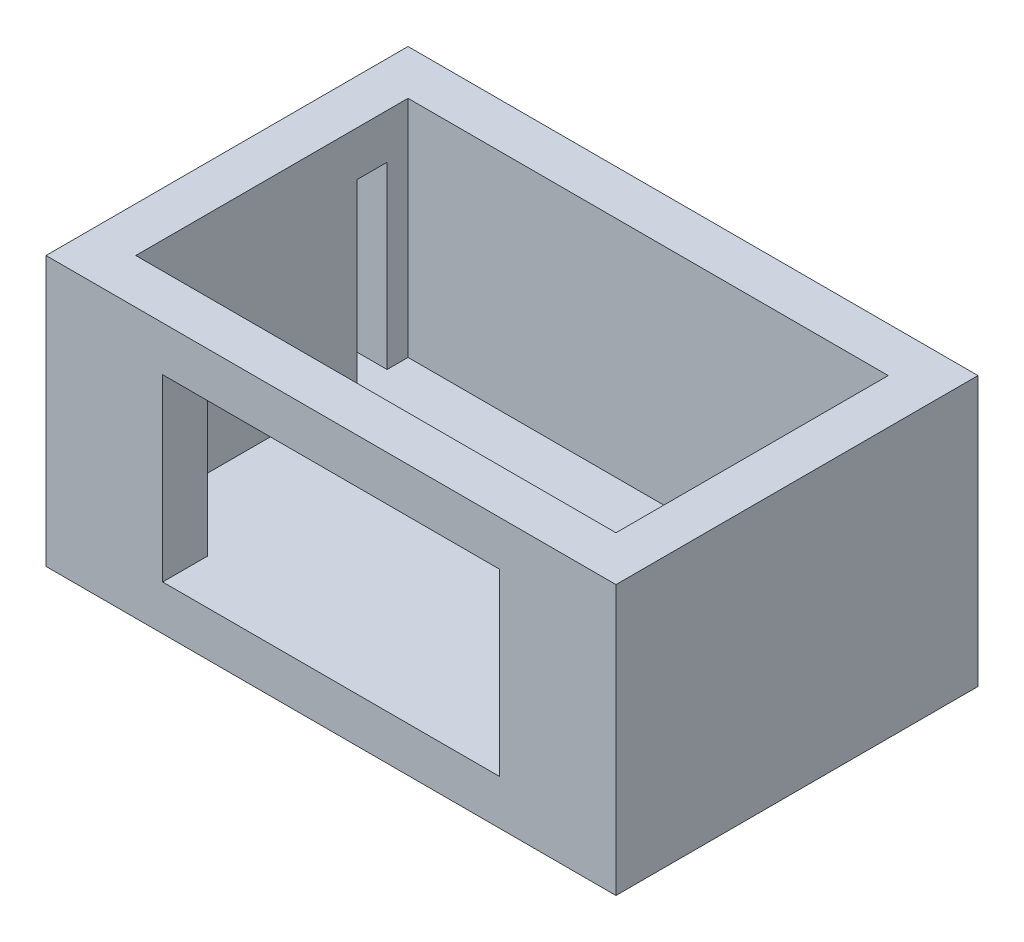
ISO-10303-21;
HEADER;
FILE_DESCRIPTION(('STEP AP214'),'2;1');
FILE_NAME('part.step','',(''),(''),'','','');
FILE_SCHEMA(('AUTOMOTIVE_DESIGN { 1 0 10303 214 1 1 1 1 }'));
ENDSEC;
DATA;
#1=APPLICATION_CONTEXT('core data for automotive mechanical design processes');
#2=APPLICATION_PROTOCOL_DEFINITION('international standard','automotive_design',2000,#1);
#3=PRODUCT_CONTEXT('',#1,'mechanical');
#4=PRODUCT('Part','Part','',(#3));
#5=PRODUCT_RELATED_PRODUCT_CATEGORY('part','',(#4));
#6=PRODUCT_DEFINITION_FORMATION('','',#4);
#7=PRODUCT_DEFINITION_CONTEXT('part definition',#1,'design');
#8=PRODUCT_DEFINITION('design','',#6,#7);
#9=PRODUCT_DEFINITION_SHAPE('','',#8);
#10=(LENGTH_UNIT() NAMED_UNIT(*) SI_UNIT(.MILLI.,.METRE.));
#11=(NAMED_UNIT(*) PLANE_ANGLE_UNIT() SI_UNIT($,.RADIAN.));
#12=(NAMED_UNIT(*) SI_UNIT($,.STERADIAN.) SOLID_ANGLE_UNIT());
#13=UNCERTAINTY_MEASURE_WITH_UNIT(LENGTH_MEASURE(1.E-05),#10,'distance_accuracy_value','');
#14=(GEOMETRIC_REPRESENTATION_CONTEXT(3) GLOBAL_UNCERTAINTY_ASSIGNED_CONTEXT((#13)) GLOBAL_UNIT_ASSIGNED_CONTEXT((#10,
#11,#12)) REPRESENTATION_CONTEXT('',''));
#15=CARTESIAN_POINT('',(0.,0.,0.));
#16=DIRECTION('',(0.,0.,1.));
#17=DIRECTION('',(1.,0.,0.));
#18=AXIS2_PLACEMENT_3D('',#15,#16,#17);
#19=CARTESIAN_POINT('',(-37.6640667415845,18.,-26.7994321045889));
#20=DIRECTION('',(1.,0.,0.));
#21=DIRECTION('',(0.,0.,-1.));
#22=AXIS2_PLACEMENT_3D('',#19,#20,#21);
#23=PLANE('',#22);
#24=DIRECTION('',(0.,-1.,0.));
#25=VECTOR('',#24,1.);
#26=CARTESIAN_POINT('',(-37.6640667415845,15.,-20.3994321045889));
#27=LINE('',#26,#25);
#28=CARTESIAN_POINT('',(-37.6640667415845,15.,-20.3994321045889));
#29=VERTEX_POINT('',#28);
#30=CARTESIAN_POINT('',(-37.6640667415845,3.,-20.3994321045889));
#31=VERTEX_POINT('',#30);
#32=EDGE_CURVE('E159',#29,#31,#27,.T.);
#33=ORIENTED_EDGE('',*,*,#32,.T.);
#34=DIRECTION('',(0.,0.,1.));
#35=VECTOR('',#34,1.);
#36=CARTESIAN_POINT('',(-37.6640667415845,3.,-22.3994321045889));
#37=LINE('',#36,#35);
#38=CARTESIAN_POINT('',(-37.6640667415845,3.,-22.3994321045889));
#39=VERTEX_POINT('',#38);
#40=EDGE_CURVE('E46',#39,#31,#37,.T.);
#41=ORIENTED_EDGE('',*,*,#40,.F.);
#42=DIRECTION('',(0.,-1.,0.));
#43=VECTOR('',#42,1.);
#44=CARTESIAN_POINT('',(-37.6640667415845,15.,-22.3994321045889));
#45=LINE('',#44,#43);
#46=CARTESIAN_POINT('',(-37.6640667415845,15.,-22.3994321045889));
#47=VERTEX_POINT('',#46);
#48=EDGE_CURVE('E165',#47,#39,#45,.T.);
#49=ORIENTED_EDGE('',*,*,#48,.F.);
#50=DIRECTION('',(0.,0.,1.));
#51=VECTOR('',#50,1.);
#52=CARTESIAN_POINT('',(-37.6640667415845,15.,-22.3994321045889));
#53=LINE('',#52,#51);
#54=EDGE_CURVE('E168',#47,#29,#53,.T.);
#55=ORIENTED_EDGE('',*,*,#54,.T.);
#56=EDGE_LOOP('',(#33,#41,#49,#55));
#57=FACE_BOUND('',#56,.T.);
#58=DIRECTION('',(0.,0.,1.));
#59=VECTOR('',#58,1.);
#60=CARTESIAN_POINT('',(-37.6640667415845,0.,-26.7994321045889));
#61=LINE('',#60,#59);
#62=CARTESIAN_POINT('',(-37.6640667415845,0.,-26.7994321045889));
#63=VERTEX_POINT('',#62);
#64=CARTESIAN_POINT('',(-37.6640667415845,0.,-2.59943210458896));
#65=VERTEX_POINT('',#64);
#66=EDGE_CURVE('E213',#63,#65,#61,.T.);
#67=ORIENTED_EDGE('',*,*,#66,.T.);
#68=DIRECTION('',(0.,-1.,0.));
#69=VECTOR('',#68,1.);
#70=CARTESIAN_POINT('',(-37.6640667415845,18.,-2.59943210458896));
#71=LINE('',#70,#69);
#72=CARTESIAN_POINT('',(-37.6640667415845,18.,-2.59943210458896));
#73=VERTEX_POINT('',#72);
#74=EDGE_CURVE('E11',#73,#65,#71,.T.);
#75=ORIENTED_EDGE('',*,*,#74,.F.);
#76=DIRECTION('',(0.,0.,1.));
#77=VECTOR('',#76,1.);
#78=CARTESIAN_POINT('',(-37.6640667415845,18.,-26.7994321045889));
#79=LINE('',#78,#77);
#80=CARTESIAN_POINT('',(-37.6640667415845,18.,-26.7994321045889));
#81=VERTEX_POINT('',#80);
#82=EDGE_CURVE('E239',#81,#73,#79,.T.);
#83=ORIENTED_EDGE('',*,*,#82,.F.);
#84=DIRECTION('',(0.,-1.,0.));
#85=VECTOR('',#84,1.);
#86=CARTESIAN_POINT('',(-37.6640667415845,18.,-26.7994321045889));
#87=LINE('',#86,#85);
#88=EDGE_CURVE('E249',#81,#63,#87,.T.);
#89=ORIENTED_EDGE('',*,*,#88,.T.);
#90=EDGE_LOOP('',(#67,#75,#83,#89));
#91=FACE_BOUND('',#90,.T.);
#92=ADVANCED_FACE('F32',(#57,#91),#23,.F.);
#93=CARTESIAN_POINT('',(-37.6640667415845,18.,-2.59943210458896));
#94=DIRECTION('',(0.,0.,-1.));
#95=DIRECTION('',(-1.,0.,0.));
#96=AXIS2_PLACEMENT_3D('',#93,#94,#95);
#97=PLANE('',#96);
#98=DIRECTION('',(0.,-1.,0.));
#99=VECTOR('',#98,1.);
#100=CARTESIAN_POINT('',(-7.36406674158448,15.,-2.59943210458896));
#101=LINE('',#100,#99);
#102=CARTESIAN_POINT('',(-7.36406674158448,15.,-2.59943210458896));
#103=VERTEX_POINT('',#102);
#104=CARTESIAN_POINT('',(-7.36406674158448,3.,-2.59943210458896));
#105=VERTEX_POINT('',#104);
#106=EDGE_CURVE('E191',#103,#105,#101,.T.);
#107=ORIENTED_EDGE('',*,*,#106,.T.);
#108=DIRECTION('',(1.,0.,0.));
#109=VECTOR('',#108,1.);
#110=CARTESIAN_POINT('',(-29.8640667415845,3.,-2.59943210458896));
#111=LINE('',#110,#109);
#112=CARTESIAN_POINT('',(-29.8640667415845,3.,-2.59943210458896));
#113=VERTEX_POINT('',#112);
#114=EDGE_CURVE('E177',#113,#105,#111,.T.);
#115=ORIENTED_EDGE('',*,*,#114,.F.);
#116=DIRECTION('',(0.,-1.,0.));
#117=VECTOR('',#116,1.);
#118=CARTESIAN_POINT('',(-29.8640667415845,15.,-2.59943210458896));
#119=LINE('',#118,#117);
#120=CARTESIAN_POINT('',(-29.8640667415845,15.,-2.59943210458896));
#121=VERTEX_POINT('',#120);
#122=EDGE_CURVE('E184',#121,#113,#119,.T.);
#123=ORIENTED_EDGE('',*,*,#122,.F.);
#124=DIRECTION('',(1.,0.,0.));
#125=VECTOR('',#124,1.);
#126=CARTESIAN_POINT('',(-29.8640667415845,15.,-2.59943210458896));
#127=LINE('',#126,#125);
#128=EDGE_CURVE('E194',#121,#103,#127,.T.);
#129=ORIENTED_EDGE('',*,*,#128,.T.);
#130=EDGE_LOOP('',(#107,#115,#123,#129));
#131=FACE_BOUND('',#130,.T.);
#132=DIRECTION('',(1.,0.,0.));
#133=VECTOR('',#132,1.);
#134=CARTESIAN_POINT('',(-37.6640667415845,0.,-2.59943210458896));
#135=LINE('',#134,#133);
#136=CARTESIAN_POINT('',(0.435933258415518,0.,-2.59943210458896));
#137=VERTEX_POINT('',#136);
#138=EDGE_CURVE('E252',#65,#137,#135,.T.);
#139=ORIENTED_EDGE('',*,*,#138,.T.);
#140=DIRECTION('',(0.,-1.,0.));
#141=VECTOR('',#140,1.);
#142=CARTESIAN_POINT('',(0.435933258415518,18.,-2.59943210458896));
#143=LINE('',#142,#141);
#144=CARTESIAN_POINT('',(0.435933258415518,18.,-2.59943210458896));
#145=VERTEX_POINT('',#144);
#146=EDGE_CURVE('E39',#145,#137,#143,.T.);
#147=ORIENTED_EDGE('',*,*,#146,.F.);
#148=DIRECTION('',(1.,0.,0.));
#149=VECTOR('',#148,1.);
#150=CARTESIAN_POINT('',(-37.6640667415845,18.,-2.59943210458896));
#151=LINE('',#150,#149);
#152=EDGE_CURVE('E242',#73,#145,#151,.T.);
#153=ORIENTED_EDGE('',*,*,#152,.F.);
#154=ORIENTED_EDGE('',*,*,#74,.T.);
#155=EDGE_LOOP('',(#139,#147,#153,#154));
#156=FACE_BOUND('',#155,.T.);
#157=ADVANCED_FACE('F282',(#131,#156),#97,.F.);
#158=CARTESIAN_POINT('',(0.435933258415518,18.,-26.7994321045889));
#159=DIRECTION('',(-1.,0.,0.));
#160=DIRECTION('',(0.,0.,1.));
#161=AXIS2_PLACEMENT_3D('',#158,#159,#160);
#162=PLANE('',#161);
#163=DIRECTION('',(0.,0.,-1.));
#164=VECTOR('',#163,1.);
#165=CARTESIAN_POINT('',(0.435933258415518,0.,-26.7994321045889));
#166=LINE('',#165,#164);
#167=CARTESIAN_POINT('',(0.435933258415518,0.,-26.7994321045889));
#168=VERTEX_POINT('',#167);
#169=EDGE_CURVE('E254',#137,#168,#166,.T.);
#170=ORIENTED_EDGE('',*,*,#169,.T.);
#171=DIRECTION('',(0.,-1.,0.));
#172=VECTOR('',#171,1.);
#173=CARTESIAN_POINT('',(0.435933258415518,18.,-26.7994321045889));
#174=LINE('',#173,#172);
#175=CARTESIAN_POINT('',(0.435933258415518,18.,-26.7994321045889));
#176=VERTEX_POINT('',#175);
#177=EDGE_CURVE('E259',#176,#168,#174,.T.);
#178=ORIENTED_EDGE('',*,*,#177,.F.);
#179=DIRECTION('',(0.,0.,-1.));
#180=VECTOR('',#179,1.);
#181=CARTESIAN_POINT('',(0.435933258415518,18.,-26.7994321045889));
#182=LINE('',#181,#180);
#183=EDGE_CURVE('E245',#145,#176,#182,.T.);
#184=ORIENTED_EDGE('',*,*,#183,.F.);
#185=ORIENTED_EDGE('',*,*,#146,.T.);
#186=EDGE_LOOP('',(#170,#178,#184,#185));
#187=FACE_BOUND('',#186,.T.);
#188=ADVANCED_FACE('F266',(#187),#162,.F.);
#189=CARTESIAN_POINT('',(-37.6640667415845,18.,-26.7994321045889));
#190=DIRECTION('',(0.,0.,1.));
#191=DIRECTION('',(1.,0.,0.));
#192=AXIS2_PLACEMENT_3D('',#189,#190,#191);
#193=PLANE('',#192);
#194=DIRECTION('',(-1.,0.,0.));
#195=VECTOR('',#194,1.);
#196=CARTESIAN_POINT('',(-37.6640667415845,0.,-26.7994321045889));
#197=LINE('',#196,#195);
#198=EDGE_CURVE('E243',#168,#63,#197,.T.);
#199=ORIENTED_EDGE('',*,*,#198,.T.);
#200=ORIENTED_EDGE('',*,*,#88,.F.);
#201=DIRECTION('',(-1.,0.,0.));
#202=VECTOR('',#201,1.);
#203=CARTESIAN_POINT('',(-37.6640667415845,18.,-26.7994321045889));
#204=LINE('',#203,#202);
#205=EDGE_CURVE('E247',#176,#81,#204,.T.);
#206=ORIENTED_EDGE('',*,*,#205,.F.);
#207=ORIENTED_EDGE('',*,*,#177,.T.);
#208=EDGE_LOOP('',(#199,#200,#206,#207));
#209=FACE_BOUND('',#208,.T.);
#210=ADVANCED_FACE('F275',(#209),#193,.F.);
#211=CARTESIAN_POINT('',(0.,18.,0.));
#212=DIRECTION('',(0.,1.,0.));
#213=DIRECTION('',(0.,0.,1.));
#214=AXIS2_PLACEMENT_3D('',#211,#212,#213);
#215=PLANE('',#214);
#216=DIRECTION('',(0.,0.,1.));
#217=VECTOR('',#216,1.);
#218=CARTESIAN_POINT('',(-34.6640667415845,18.,-26.7994321045889));
#219=LINE('',#218,#217);
#220=CARTESIAN_POINT('',(-34.6640667415845,18.,-23.7994321045889));
#221=VERTEX_POINT('',#220);
#222=CARTESIAN_POINT('',(-34.6640667415845,18.,-5.59943210458896));
#223=VERTEX_POINT('',#222);
#224=EDGE_CURVE('E231',#221,#223,#219,.T.);
#225=ORIENTED_EDGE('',*,*,#224,.F.);
#226=DIRECTION('',(-1.,0.,0.));
#227=VECTOR('',#226,1.);
#228=CARTESIAN_POINT('',(-37.6640667415845,18.,-23.7994321045889));
#229=LINE('',#228,#227);
#230=CARTESIAN_POINT('',(-2.56406674158448,18.,-23.7994321045889));
#231=VERTEX_POINT('',#230);
#232=EDGE_CURVE('E219',#231,#221,#229,.T.);
#233=ORIENTED_EDGE('',*,*,#232,.F.);
#234=DIRECTION('',(0.,0.,-1.));
#235=VECTOR('',#234,1.);
#236=CARTESIAN_POINT('',(-2.56406674158448,18.,-26.7994321045889));
#237=LINE('',#236,#235);
#238=CARTESIAN_POINT('',(-2.56406674158448,18.,-5.59943210458896));
#239=VERTEX_POINT('',#238);
#240=EDGE_CURVE('E235',#239,#231,#237,.T.);
#241=ORIENTED_EDGE('',*,*,#240,.F.);
#242=DIRECTION('',(1.,0.,0.));
#243=VECTOR('',#242,1.);
#244=CARTESIAN_POINT('',(-37.6640667415845,18.,-5.59943210458896));
#245=LINE('',#244,#243);
#246=EDGE_CURVE('E233',#223,#239,#245,.T.);
#247=ORIENTED_EDGE('',*,*,#246,.F.);
#248=EDGE_LOOP('',(#225,#233,#241,#247));
#249=FACE_BOUND('',#248,.T.);
#250=ORIENTED_EDGE('',*,*,#82,.T.);
#251=ORIENTED_EDGE('',*,*,#152,.T.);
#252=ORIENTED_EDGE('',*,*,#183,.T.);
#253=ORIENTED_EDGE('',*,*,#205,.T.);
#254=EDGE_LOOP('',(#250,#251,#252,#253));
#255=FACE_BOUND('',#254,.T.);
#256=ADVANCED_FACE('F281',(#249,#255),#215,.T.);
#257=CARTESIAN_POINT('',(0.,0.,0.));
#258=DIRECTION('',(0.,1.,0.));
#259=DIRECTION('',(0.,0.,1.));
#260=AXIS2_PLACEMENT_3D('',#257,#258,#259);
#261=PLANE('',#260);
#262=ORIENTED_EDGE('',*,*,#66,.F.);
#263=ORIENTED_EDGE('',*,*,#198,.F.);
#264=ORIENTED_EDGE('',*,*,#169,.F.);
#265=ORIENTED_EDGE('',*,*,#138,.F.);
#266=EDGE_LOOP('',(#262,#263,#264,#265));
#267=FACE_BOUND('',#266,.T.);
#268=ADVANCED_FACE('F272',(#267),#261,.F.);
#269=CARTESIAN_POINT('',(-34.6640667415845,18.,-26.7994321045889));
#270=DIRECTION('',(1.,0.,0.));
#271=DIRECTION('',(0.,0.,-1.));
#272=AXIS2_PLACEMENT_3D('',#269,#270,#271);
#273=PLANE('',#272);
#274=DIRECTION('',(0.,-1.,0.));
#275=VECTOR('',#274,1.);
#276=CARTESIAN_POINT('',(-34.6640667415845,15.,-22.3994321045889));
#277=LINE('',#276,#275);
#278=CARTESIAN_POINT('',(-34.6640667415845,15.,-22.3994321045889));
#279=VERTEX_POINT('',#278);
#280=CARTESIAN_POINT('',(-34.6640667415845,3.,-22.3994321045889));
#281=VERTEX_POINT('',#280);
#282=EDGE_CURVE('E152',#279,#281,#277,.T.);
#283=ORIENTED_EDGE('',*,*,#282,.T.);
#284=DIRECTION('',(0.,0.,1.));
#285=VECTOR('',#284,1.);
#286=CARTESIAN_POINT('',(-34.6640667415845,3.,-26.7994321045889));
#287=LINE('',#286,#285);
#288=CARTESIAN_POINT('',(-34.6640667415845,3.,-23.7994321045889));
#289=VERTEX_POINT('',#288);
#290=EDGE_CURVE('E207',#289,#281,#287,.T.);
#291=ORIENTED_EDGE('',*,*,#290,.F.);
#292=DIRECTION('',(0.,-1.,0.));
#293=VECTOR('',#292,1.);
#294=CARTESIAN_POINT('',(-34.6640667415845,18.,-23.7994321045889));
#295=LINE('',#294,#293);
#296=EDGE_CURVE('E215',#221,#289,#295,.T.);
#297=ORIENTED_EDGE('',*,*,#296,.F.);
#298=ORIENTED_EDGE('',*,*,#224,.T.);
#299=DIRECTION('',(0.,-1.,0.));
#300=VECTOR('',#299,1.);
#301=CARTESIAN_POINT('',(-34.6640667415845,18.,-5.59943210458896));
#302=LINE('',#301,#300);
#303=CARTESIAN_POINT('',(-34.6640667415845,3.,-5.59943210458896));
#304=VERTEX_POINT('',#303);
#305=EDGE_CURVE('E211',#223,#304,#302,.T.);
#306=ORIENTED_EDGE('',*,*,#305,.T.);
#307=CARTESIAN_POINT('',(-34.6640667415845,3.,-20.3994321045889));
#308=VERTEX_POINT('',#307);
#309=EDGE_CURVE('E164',#308,#304,#287,.T.);
#310=ORIENTED_EDGE('',*,*,#309,.F.);
#311=DIRECTION('',(0.,-1.,0.));
#312=VECTOR('',#311,1.);
#313=CARTESIAN_POINT('',(-34.6640667415845,15.,-20.3994321045889));
#314=LINE('',#313,#312);
#315=CARTESIAN_POINT('',(-34.6640667415845,15.,-20.3994321045889));
#316=VERTEX_POINT('',#315);
#317=EDGE_CURVE('E153',#316,#308,#314,.T.);
#318=ORIENTED_EDGE('',*,*,#317,.F.);
#319=DIRECTION('',(0.,0.,1.));
#320=VECTOR('',#319,1.);
#321=CARTESIAN_POINT('',(-34.6640667415845,15.,-22.3994321045889));
#322=LINE('',#321,#320);
#323=EDGE_CURVE('E141',#279,#316,#322,.T.);
#324=ORIENTED_EDGE('',*,*,#323,.F.);
#325=EDGE_LOOP('',(#283,#291,#297,#298,#306,#310,#318,#324));
#326=FACE_BOUND('',#325,.T.);
#327=ADVANCED_FACE('F162',(#326),#273,.T.);
#328=CARTESIAN_POINT('',(-37.6640667415845,18.,-5.59943210458896));
#329=DIRECTION('',(0.,0.,-1.));
#330=DIRECTION('',(-1.,0.,0.));
#331=AXIS2_PLACEMENT_3D('',#328,#329,#330);
#332=PLANE('',#331);
#333=DIRECTION('',(0.,-1.,0.));
#334=VECTOR('',#333,1.);
#335=CARTESIAN_POINT('',(-29.8640667415845,15.,-5.59943210458896));
#336=LINE('',#335,#334);
#337=CARTESIAN_POINT('',(-29.8640667415845,15.,-5.59943210458896));
#338=VERTEX_POINT('',#337);
#339=CARTESIAN_POINT('',(-29.8640667415845,3.,-5.59943210458896));
#340=VERTEX_POINT('',#339);
#341=EDGE_CURVE('E186',#338,#340,#336,.T.);
#342=ORIENTED_EDGE('',*,*,#341,.T.);
#343=DIRECTION('',(1.,0.,0.));
#344=VECTOR('',#343,1.);
#345=CARTESIAN_POINT('',(-37.6640667415845,3.,-5.59943210458896));
#346=LINE('',#345,#344);
#347=EDGE_CURVE('E220',#304,#340,#346,.T.);
#348=ORIENTED_EDGE('',*,*,#347,.F.);
#349=ORIENTED_EDGE('',*,*,#305,.F.);
#350=ORIENTED_EDGE('',*,*,#246,.T.);
#351=DIRECTION('',(0.,-1.,0.));
#352=VECTOR('',#351,1.);
#353=CARTESIAN_POINT('',(-2.56406674158448,18.,-5.59943210458896));
#354=LINE('',#353,#352);
#355=CARTESIAN_POINT('',(-2.56406674158448,3.,-5.59943210458896));
#356=VERTEX_POINT('',#355);
#357=EDGE_CURVE('E214',#239,#356,#354,.T.);
#358=ORIENTED_EDGE('',*,*,#357,.T.);
#359=CARTESIAN_POINT('',(-7.36406674158448,3.,-5.59943210458896));
#360=VERTEX_POINT('',#359);
#361=EDGE_CURVE('E210',#360,#356,#346,.T.);
#362=ORIENTED_EDGE('',*,*,#361,.F.);
#363=DIRECTION('',(0.,-1.,0.));
#364=VECTOR('',#363,1.);
#365=CARTESIAN_POINT('',(-7.36406674158448,15.,-5.59943210458896));
#366=LINE('',#365,#364);
#367=CARTESIAN_POINT('',(-7.36406674158448,15.,-5.59943210458896));
#368=VERTEX_POINT('',#367);
#369=EDGE_CURVE('E180',#368,#360,#366,.T.);
#370=ORIENTED_EDGE('',*,*,#369,.F.);
#371=DIRECTION('',(1.,0.,0.));
#372=VECTOR('',#371,1.);
#373=CARTESIAN_POINT('',(-29.8640667415845,15.,-5.59943210458896));
#374=LINE('',#373,#372);
#375=EDGE_CURVE('E183',#338,#368,#374,.T.);
#376=ORIENTED_EDGE('',*,*,#375,.F.);
#377=EDGE_LOOP('',(#342,#348,#349,#350,#358,#362,#370,#376));
#378=FACE_BOUND('',#377,.T.);
#379=ADVANCED_FACE('F310',(#378),#332,.T.);
#380=CARTESIAN_POINT('',(-2.56406674158448,18.,-26.7994321045889));
#381=DIRECTION('',(-1.,0.,0.));
#382=DIRECTION('',(0.,0.,1.));
#383=AXIS2_PLACEMENT_3D('',#380,#381,#382);
#384=PLANE('',#383);
#385=DIRECTION('',(0.,0.,-1.));
#386=VECTOR('',#385,1.);
#387=CARTESIAN_POINT('',(-2.56406674158448,3.,-26.7994321045889));
#388=LINE('',#387,#386);
#389=CARTESIAN_POINT('',(-2.56406674158448,3.,-23.7994321045889));
#390=VERTEX_POINT('',#389);
#391=EDGE_CURVE('E223',#356,#390,#388,.T.);
#392=ORIENTED_EDGE('',*,*,#391,.F.);
#393=ORIENTED_EDGE('',*,*,#357,.F.);
#394=ORIENTED_EDGE('',*,*,#240,.T.);
#395=DIRECTION('',(0.,-1.,0.));
#396=VECTOR('',#395,1.);
#397=CARTESIAN_POINT('',(-2.56406674158448,18.,-23.7994321045889));
#398=LINE('',#397,#396);
#399=EDGE_CURVE('E218',#231,#390,#398,.T.);
#400=ORIENTED_EDGE('',*,*,#399,.T.);
#401=EDGE_LOOP('',(#392,#393,#394,#400));
#402=FACE_BOUND('',#401,.T.);
#403=ADVANCED_FACE('F306',(#402),#384,.T.);
#404=CARTESIAN_POINT('',(-37.6640667415845,18.,-23.7994321045889));
#405=DIRECTION('',(0.,0.,1.));
#406=DIRECTION('',(1.,0.,0.));
#407=AXIS2_PLACEMENT_3D('',#404,#405,#406);
#408=PLANE('',#407);
#409=DIRECTION('',(-1.,0.,0.));
#410=VECTOR('',#409,1.);
#411=CARTESIAN_POINT('',(-37.6640667415845,3.,-23.7994321045889));
#412=LINE('',#411,#410);
#413=EDGE_CURVE('E227',#390,#289,#412,.T.);
#414=ORIENTED_EDGE('',*,*,#413,.F.);
#415=ORIENTED_EDGE('',*,*,#399,.F.);
#416=ORIENTED_EDGE('',*,*,#232,.T.);
#417=ORIENTED_EDGE('',*,*,#296,.T.);
#418=EDGE_LOOP('',(#414,#415,#416,#417));
#419=FACE_BOUND('',#418,.T.);
#420=ADVANCED_FACE('F303',(#419),#408,.T.);
#421=CARTESIAN_POINT('',(0.,3.,0.));
#422=DIRECTION('',(0.,1.,0.));
#423=DIRECTION('',(0.,0.,1.));
#424=AXIS2_PLACEMENT_3D('',#421,#422,#423);
#425=PLANE('',#424);
#426=ORIENTED_EDGE('',*,*,#290,.T.);
#427=DIRECTION('',(-1.,0.,0.));
#428=VECTOR('',#427,1.);
#429=CARTESIAN_POINT('',(-34.6640667415845,3.,-22.3994321045889));
#430=LINE('',#429,#428);
#431=EDGE_CURVE('E175',#281,#39,#430,.T.);
#432=ORIENTED_EDGE('',*,*,#431,.T.);
#433=ORIENTED_EDGE('',*,*,#40,.T.);
#434=DIRECTION('',(-1.,0.,0.));
#435=VECTOR('',#434,1.);
#436=CARTESIAN_POINT('',(-34.6640667415845,3.,-20.3994321045889));
#437=LINE('',#436,#435);
#438=EDGE_CURVE('E50',#308,#31,#437,.T.);
#439=ORIENTED_EDGE('',*,*,#438,.F.);
#440=ORIENTED_EDGE('',*,*,#309,.T.);
#441=ORIENTED_EDGE('',*,*,#347,.T.);
#442=DIRECTION('',(0.,0.,1.));
#443=VECTOR('',#442,1.);
#444=CARTESIAN_POINT('',(-29.8640667415845,3.,-5.59943210458896));
#445=LINE('',#444,#443);
#446=EDGE_CURVE('E199',#340,#113,#445,.T.);
#447=ORIENTED_EDGE('',*,*,#446,.T.);
#448=ORIENTED_EDGE('',*,*,#114,.T.);
#449=DIRECTION('',(0.,0.,1.));
#450=VECTOR('',#449,1.);
#451=CARTESIAN_POINT('',(-7.36406674158448,3.,-5.59943210458896));
#452=LINE('',#451,#450);
#453=EDGE_CURVE('E189',#360,#105,#452,.T.);
#454=ORIENTED_EDGE('',*,*,#453,.F.);
#455=ORIENTED_EDGE('',*,*,#361,.T.);
#456=ORIENTED_EDGE('',*,*,#391,.T.);
#457=ORIENTED_EDGE('',*,*,#413,.T.);
#458=EDGE_LOOP('',(#426,#432,#433,#439,#440,#441,#447,#448,#454,#455,#456,#457));
#459=FACE_BOUND('',#458,.T.);
#460=ADVANCED_FACE('F299',(#459),#425,.T.);
#461=CARTESIAN_POINT('',(-29.8640667415845,15.,-5.59943210458896));
#462=DIRECTION('',(-1.,0.,0.));
#463=DIRECTION('',(0.,0.,1.));
#464=AXIS2_PLACEMENT_3D('',#461,#462,#463);
#465=PLANE('',#464);
#466=ORIENTED_EDGE('',*,*,#122,.T.);
#467=ORIENTED_EDGE('',*,*,#446,.F.);
#468=ORIENTED_EDGE('',*,*,#341,.F.);
#469=DIRECTION('',(0.,0.,1.));
#470=VECTOR('',#469,1.);
#471=CARTESIAN_POINT('',(-29.8640667415845,15.,-5.59943210458896));
#472=LINE('',#471,#470);
#473=EDGE_CURVE('E201',#338,#121,#472,.T.);
#474=ORIENTED_EDGE('',*,*,#473,.T.);
#475=EDGE_LOOP('',(#466,#467,#468,#474));
#476=FACE_BOUND('',#475,.T.);
#477=ADVANCED_FACE('F302',(#476),#465,.F.);
#478=CARTESIAN_POINT('',(-29.8640667415845,15.,-5.59943210458896));
#479=DIRECTION('',(0.,-1.,0.));
#480=DIRECTION('',(0.,0.,-1.));
#481=AXIS2_PLACEMENT_3D('',#478,#479,#480);
#482=PLANE('',#481);
#483=ORIENTED_EDGE('',*,*,#128,.F.);
#484=ORIENTED_EDGE('',*,*,#473,.F.);
#485=ORIENTED_EDGE('',*,*,#375,.T.);
#486=DIRECTION('',(0.,0.,1.));
#487=VECTOR('',#486,1.);
#488=CARTESIAN_POINT('',(-7.36406674158448,15.,-5.59943210458896));
#489=LINE('',#488,#487);
#490=EDGE_CURVE('E203',#368,#103,#489,.T.);
#491=ORIENTED_EDGE('',*,*,#490,.T.);
#492=EDGE_LOOP('',(#483,#484,#485,#491));
#493=FACE_BOUND('',#492,.T.);
#494=ADVANCED_FACE('F321',(#493),#482,.T.);
#495=CARTESIAN_POINT('',(-7.36406674158448,15.,-5.59943210458896));
#496=DIRECTION('',(-1.,0.,0.));
#497=DIRECTION('',(0.,0.,1.));
#498=AXIS2_PLACEMENT_3D('',#495,#496,#497);
#499=PLANE('',#498);
#500=ORIENTED_EDGE('',*,*,#106,.F.);
#501=ORIENTED_EDGE('',*,*,#490,.F.);
#502=ORIENTED_EDGE('',*,*,#369,.T.);
#503=ORIENTED_EDGE('',*,*,#453,.T.);
#504=EDGE_LOOP('',(#500,#501,#502,#503));
#505=FACE_BOUND('',#504,.T.);
#506=ADVANCED_FACE('F317',(#505),#499,.T.);
#507=CARTESIAN_POINT('',(-34.6640667415845,15.,-22.3994321045889));
#508=DIRECTION('',(0.,0.,-1.));
#509=DIRECTION('',(0.,1.,0.));
#510=AXIS2_PLACEMENT_3D('',#507,#508,#509);
#511=PLANE('',#510);
#512=ORIENTED_EDGE('',*,*,#48,.T.);
#513=ORIENTED_EDGE('',*,*,#431,.F.);
#514=ORIENTED_EDGE('',*,*,#282,.F.);
#515=DIRECTION('',(-1.,0.,0.));
#516=VECTOR('',#515,1.);
#517=CARTESIAN_POINT('',(-34.6640667415845,15.,-22.3994321045889));
#518=LINE('',#517,#516);
#519=EDGE_CURVE('E147',#279,#47,#518,.T.);
#520=ORIENTED_EDGE('',*,*,#519,.T.);
#521=EDGE_LOOP('',(#512,#513,#514,#520));
#522=FACE_BOUND('',#521,.T.);
#523=ADVANCED_FACE('F320',(#522),#511,.F.);
#524=CARTESIAN_POINT('',(-34.6640667415845,15.,-22.3994321045889));
#525=DIRECTION('',(0.,-1.,0.));
#526=DIRECTION('',(0.,0.,-1.));
#527=AXIS2_PLACEMENT_3D('',#524,#525,#526);
#528=PLANE('',#527);
#529=ORIENTED_EDGE('',*,*,#54,.F.);
#530=ORIENTED_EDGE('',*,*,#519,.F.);
#531=ORIENTED_EDGE('',*,*,#323,.T.);
#532=DIRECTION('',(-1.,0.,0.));
#533=VECTOR('',#532,1.);
#534=CARTESIAN_POINT('',(-34.6640667415845,15.,-20.3994321045889));
#535=LINE('',#534,#533);
#536=EDGE_CURVE('E145',#316,#29,#535,.T.);
#537=ORIENTED_EDGE('',*,*,#536,.T.);
#538=EDGE_LOOP('',(#529,#530,#531,#537));
#539=FACE_BOUND('',#538,.T.);
#540=ADVANCED_FACE('F144',(#539),#528,.T.);
#541=CARTESIAN_POINT('',(-34.6640667415845,15.,-20.3994321045889));
#542=DIRECTION('',(0.,0.,-1.));
#543=DIRECTION('',(-1.,0.,0.));
#544=AXIS2_PLACEMENT_3D('',#541,#542,#543);
#545=PLANE('',#544);
#546=ORIENTED_EDGE('',*,*,#32,.F.);
#547=ORIENTED_EDGE('',*,*,#536,.F.);
#548=ORIENTED_EDGE('',*,*,#317,.T.);
#549=ORIENTED_EDGE('',*,*,#438,.T.);
#550=EDGE_LOOP('',(#546,#547,#548,#549));
#551=FACE_BOUND('',#550,.T.);
#552=ADVANCED_FACE('F156',(#551),#545,.T.);
#553=CLOSED_SHELL('',(#92,#157,#188,#210,#256,#268,#327,#379,#403,#420,#460,#477,#494,#506,#523,
#540,#552));
#554=MANIFOLD_SOLID_BREP('B2',#553);
#555=ADVANCED_BREP_SHAPE_REPRESENTATION('',(#18,#554),#14);
#556=SHAPE_DEFINITION_REPRESENTATION(#9,#555);
ENDSEC;
END-ISO-10303-21;
